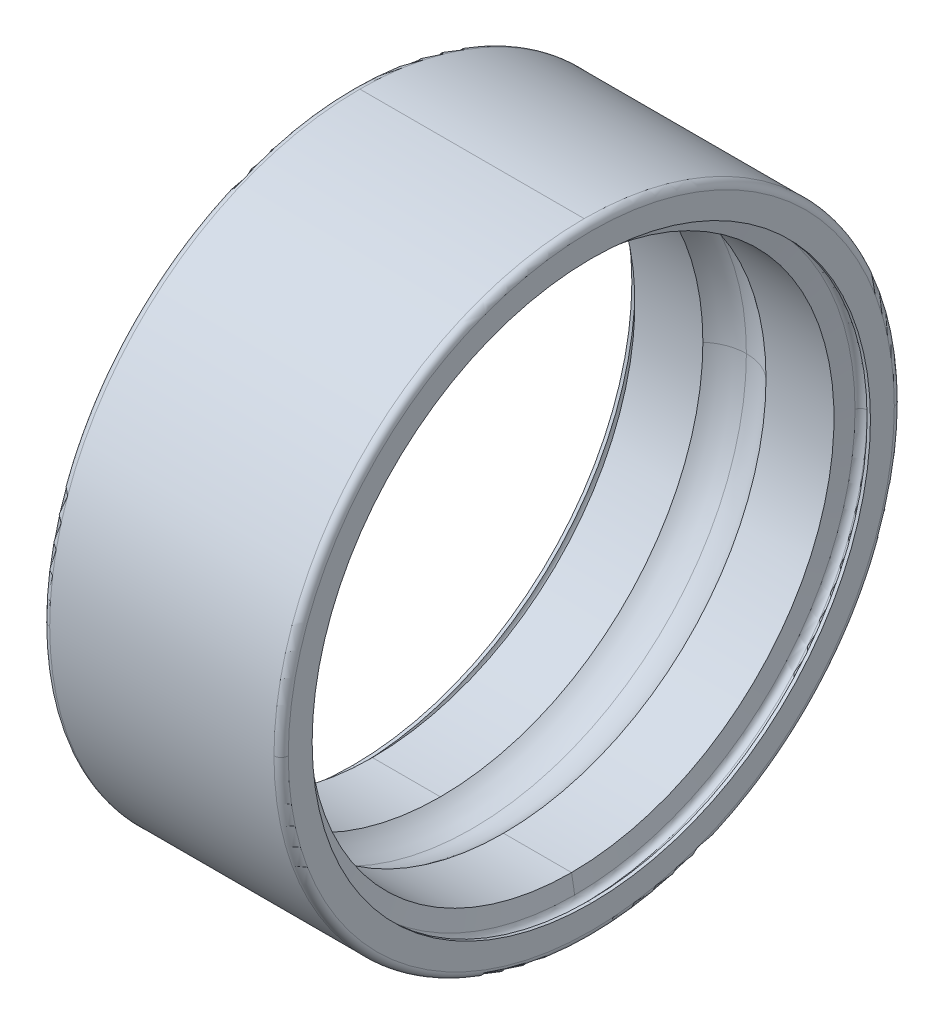
ISO-10303-21;
HEADER;
FILE_DESCRIPTION(('STEP AP214'),'2;1');
FILE_NAME('part.step','',(''),(''),'','','');
FILE_SCHEMA(('AUTOMOTIVE_DESIGN { 1 0 10303 214 1 1 1 1 }'));
ENDSEC;
DATA;
#1=APPLICATION_CONTEXT('core data for automotive mechanical design processes');
#2=APPLICATION_PROTOCOL_DEFINITION('international standard','automotive_design',2000,#1);
#3=PRODUCT_CONTEXT('',#1,'mechanical');
#4=PRODUCT('Part','Part','',(#3));
#5=PRODUCT_RELATED_PRODUCT_CATEGORY('part','',(#4));
#6=PRODUCT_DEFINITION_FORMATION('','',#4);
#7=PRODUCT_DEFINITION_CONTEXT('part definition',#1,'design');
#8=PRODUCT_DEFINITION('design','',#6,#7);
#9=PRODUCT_DEFINITION_SHAPE('','',#8);
#10=(LENGTH_UNIT() NAMED_UNIT(*) SI_UNIT(.MILLI.,.METRE.));
#11=(NAMED_UNIT(*) PLANE_ANGLE_UNIT() SI_UNIT($,.RADIAN.));
#12=(NAMED_UNIT(*) SI_UNIT($,.STERADIAN.) SOLID_ANGLE_UNIT());
#13=UNCERTAINTY_MEASURE_WITH_UNIT(LENGTH_MEASURE(1.E-05),#10,'distance_accuracy_value','');
#14=(GEOMETRIC_REPRESENTATION_CONTEXT(3) GLOBAL_UNCERTAINTY_ASSIGNED_CONTEXT((#13)) GLOBAL_UNIT_ASSIGNED_CONTEXT((#10,
#11,#12)) REPRESENTATION_CONTEXT('',''));
#15=CARTESIAN_POINT('',(0.,0.,0.));
#16=DIRECTION('',(0.,0.,1.));
#17=DIRECTION('',(1.,0.,0.));
#18=AXIS2_PLACEMENT_3D('',#15,#16,#17);
#19=CARTESIAN_POINT('',(4.79,0.,0.));
#20=DIRECTION('',(1.,0.,0.));
#21=DIRECTION('',(0.,0.,-1.));
#22=AXIS2_PLACEMENT_3D('',#19,#20,#21);
#23=TOROIDAL_SURFACE('',#22,5.85,0.14);
#24=CARTESIAN_POINT('',(4.79,0.,0.));
#25=DIRECTION('',(1.,0.,0.));
#26=DIRECTION('',(0.,0.,1.));
#27=AXIS2_PLACEMENT_3D('',#24,#25,#26);
#28=CIRCLE('',#27,5.99);
#29=CARTESIAN_POINT('',(4.79,0.,-5.99));
#30=VERTEX_POINT('',#29);
#31=CARTESIAN_POINT('',(4.79,0.,5.99));
#32=VERTEX_POINT('',#31);
#33=EDGE_CURVE('E420',#30,#32,#28,.T.);
#34=ORIENTED_EDGE('',*,*,#33,.T.);
#35=CARTESIAN_POINT('',(4.79,0.,5.85));
#36=DIRECTION('',(0.,-1.,0.));
#37=DIRECTION('',(0.,0.,1.));
#38=AXIS2_PLACEMENT_3D('',#35,#36,#37);
#39=CIRCLE('',#38,0.14);
#40=CARTESIAN_POINT('',(4.65212691457829,0.,5.87431074487337));
#41=VERTEX_POINT('',#40);
#42=EDGE_CURVE('E266',#32,#41,#39,.T.);
#43=ORIENTED_EDGE('',*,*,#42,.T.);
#44=CARTESIAN_POINT('',(4.65212691457829,0.,0.));
#45=DIRECTION('',(1.,0.,0.));
#46=DIRECTION('',(0.,1.,0.));
#47=AXIS2_PLACEMENT_3D('',#44,#45,#46);
#48=CIRCLE('',#47,5.87431074487337);
#49=CARTESIAN_POINT('',(4.65212691457829,5.87431074487337,0.));
#50=VERTEX_POINT('',#49);
#51=EDGE_CURVE('E31',#50,#41,#48,.T.);
#52=ORIENTED_EDGE('',*,*,#51,.F.);
#53=CARTESIAN_POINT('',(4.65212691457829,0.,0.));
#54=DIRECTION('',(1.,0.,0.));
#55=DIRECTION('',(0.,1.,0.));
#56=AXIS2_PLACEMENT_3D('',#53,#54,#55);
#57=CIRCLE('',#56,5.87431074487337);
#58=CARTESIAN_POINT('',(4.65212691457829,0.,-5.87431074487337));
#59=VERTEX_POINT('',#58);
#60=EDGE_CURVE('E204',#59,#50,#57,.T.);
#61=ORIENTED_EDGE('',*,*,#60,.F.);
#62=CARTESIAN_POINT('',(4.79,0.,-5.85));
#63=DIRECTION('',(0.,-1.,0.));
#64=DIRECTION('',(0.,0.,-1.));
#65=AXIS2_PLACEMENT_3D('',#62,#63,#64);
#66=CIRCLE('',#65,0.14);
#67=EDGE_CURVE('E252',#59,#30,#66,.T.);
#68=ORIENTED_EDGE('',*,*,#67,.T.);
#69=EDGE_LOOP('',(#34,#43,#52,#61,#68));
#70=FACE_BOUND('',#69,.T.);
#71=ADVANCED_FACE('F16',(#70),#23,.F.);
#72=CARTESIAN_POINT('',(4.965,0.,0.));
#73=DIRECTION('',(1.,0.,0.));
#74=DIRECTION('',(0.,1.,0.));
#75=AXIS2_PLACEMENT_3D('',#72,#73,#74);
#76=CYLINDRICAL_SURFACE('',#75,5.85);
#77=DIRECTION('',(1.,0.,0.));
#78=VECTOR('',#77,1.);
#79=CARTESIAN_POINT('',(4.965,5.85,0.));
#80=LINE('',#79,#78);
#81=CARTESIAN_POINT('',(4.93,5.85,0.));
#82=VERTEX_POINT('',#81);
#83=CARTESIAN_POINT('',(5.,5.85,0.));
#84=VERTEX_POINT('',#83);
#85=EDGE_CURVE('E268',#82,#84,#80,.T.);
#86=ORIENTED_EDGE('',*,*,#85,.T.);
#87=CARTESIAN_POINT('',(5.,0.,0.));
#88=DIRECTION('',(1.,0.,0.));
#89=DIRECTION('',(0.,1.,0.));
#90=AXIS2_PLACEMENT_3D('',#87,#88,#89);
#91=CIRCLE('',#90,5.85);
#92=CARTESIAN_POINT('',(5.,-5.85,0.));
#93=VERTEX_POINT('',#92);
#94=EDGE_CURVE('E11',#84,#93,#91,.T.);
#95=ORIENTED_EDGE('',*,*,#94,.T.);
#96=DIRECTION('',(-1.,0.,0.));
#97=VECTOR('',#96,1.);
#98=CARTESIAN_POINT('',(4.965,-5.85,0.));
#99=LINE('',#98,#97);
#100=CARTESIAN_POINT('',(4.93,-5.85,0.));
#101=VERTEX_POINT('',#100);
#102=EDGE_CURVE('E271',#93,#101,#99,.T.);
#103=ORIENTED_EDGE('',*,*,#102,.T.);
#104=CARTESIAN_POINT('',(4.93,0.,0.));
#105=DIRECTION('',(1.,0.,0.));
#106=DIRECTION('',(0.,1.,0.));
#107=AXIS2_PLACEMENT_3D('',#104,#105,#106);
#108=CIRCLE('',#107,5.85);
#109=CARTESIAN_POINT('',(4.93,0.,5.85));
#110=VERTEX_POINT('',#109);
#111=EDGE_CURVE('E241',#110,#101,#108,.T.);
#112=ORIENTED_EDGE('',*,*,#111,.F.);
#113=CARTESIAN_POINT('',(4.93,0.,0.));
#114=DIRECTION('',(1.,0.,0.));
#115=DIRECTION('',(0.,1.,0.));
#116=AXIS2_PLACEMENT_3D('',#113,#114,#115);
#117=CIRCLE('',#116,5.85);
#118=EDGE_CURVE('E386',#82,#110,#117,.T.);
#119=ORIENTED_EDGE('',*,*,#118,.F.);
#120=EDGE_LOOP('',(#86,#95,#103,#112,#119));
#121=FACE_BOUND('',#120,.T.);
#122=ADVANCED_FACE('F410',(#121),#76,.F.);
#123=CARTESIAN_POINT('',(5.,6.1,0.));
#124=DIRECTION('',(1.,0.,0.));
#125=DIRECTION('',(0.,1.,0.));
#126=AXIS2_PLACEMENT_3D('',#123,#124,#125);
#127=PLANE('',#126);
#128=ORIENTED_EDGE('',*,*,#94,.F.);
#129=CARTESIAN_POINT('',(5.,0.,0.));
#130=DIRECTION('',(1.,0.,0.));
#131=DIRECTION('',(0.,1.,0.));
#132=AXIS2_PLACEMENT_3D('',#129,#130,#131);
#133=CIRCLE('',#132,5.85);
#134=EDGE_CURVE('E273',#93,#84,#133,.T.);
#135=ORIENTED_EDGE('',*,*,#134,.F.);
#136=EDGE_LOOP('',(#128,#135));
#137=FACE_BOUND('',#136,.T.);
#138=CARTESIAN_POINT('',(5.,0.,0.));
#139=DIRECTION('',(1.,0.,0.));
#140=DIRECTION('',(0.,1.,0.));
#141=AXIS2_PLACEMENT_3D('',#138,#139,#140);
#142=CIRCLE('',#141,6.35);
#143=CARTESIAN_POINT('',(5.,0.,6.35));
#144=VERTEX_POINT('',#143);
#145=CARTESIAN_POINT('',(5.,0.,-6.35));
#146=VERTEX_POINT('',#145);
#147=EDGE_CURVE('E19',#144,#146,#142,.T.);
#148=ORIENTED_EDGE('',*,*,#147,.T.);
#149=CARTESIAN_POINT('',(5.,0.,0.));
#150=DIRECTION('',(1.,0.,0.));
#151=DIRECTION('',(0.,1.,0.));
#152=AXIS2_PLACEMENT_3D('',#149,#150,#151);
#153=CIRCLE('',#152,6.35);
#154=EDGE_CURVE('E279',#146,#144,#153,.T.);
#155=ORIENTED_EDGE('',*,*,#154,.T.);
#156=EDGE_LOOP('',(#148,#155));
#157=FACE_BOUND('',#156,.T.);
#158=ADVANCED_FACE('F414',(#137,#157),#127,.T.);
#159=CARTESIAN_POINT('',(4.85,0.,0.));
#160=DIRECTION('',(1.,0.,0.));
#161=DIRECTION('',(0.,0.,-1.));
#162=AXIS2_PLACEMENT_3D('',#159,#160,#161);
#163=TOROIDAL_SURFACE('',#162,6.35,0.15);
#164=CARTESIAN_POINT('',(4.85,0.,-6.35));
#165=DIRECTION('',(0.,-1.,0.));
#166=DIRECTION('',(0.,0.,-1.));
#167=AXIS2_PLACEMENT_3D('',#164,#165,#166);
#168=CIRCLE('',#167,0.15);
#169=CARTESIAN_POINT('',(4.85,0.,-6.5));
#170=VERTEX_POINT('',#169);
#171=EDGE_CURVE('E276',#170,#146,#168,.T.);
#172=ORIENTED_EDGE('',*,*,#171,.T.);
#173=ORIENTED_EDGE('',*,*,#147,.F.);
#174=CARTESIAN_POINT('',(4.85,0.,6.35));
#175=DIRECTION('',(0.,-1.,0.));
#176=DIRECTION('',(0.,0.,1.));
#177=AXIS2_PLACEMENT_3D('',#174,#175,#176);
#178=CIRCLE('',#177,0.15);
#179=CARTESIAN_POINT('',(4.85,0.,6.5));
#180=VERTEX_POINT('',#179);
#181=EDGE_CURVE('E283',#144,#180,#178,.T.);
#182=ORIENTED_EDGE('',*,*,#181,.T.);
#183=CARTESIAN_POINT('',(4.85,0.,0.));
#184=DIRECTION('',(1.,0.,0.));
#185=DIRECTION('',(0.,1.,0.));
#186=AXIS2_PLACEMENT_3D('',#183,#184,#185);
#187=CIRCLE('',#186,6.5);
#188=CARTESIAN_POINT('',(4.85,-6.5,0.));
#189=VERTEX_POINT('',#188);
#190=EDGE_CURVE('E293',#180,#189,#187,.T.);
#191=ORIENTED_EDGE('',*,*,#190,.T.);
#192=CARTESIAN_POINT('',(4.85,0.,0.));
#193=DIRECTION('',(1.,0.,0.));
#194=DIRECTION('',(0.,1.,0.));
#195=AXIS2_PLACEMENT_3D('',#192,#193,#194);
#196=CIRCLE('',#195,6.5);
#197=EDGE_CURVE('E214',#189,#170,#196,.T.);
#198=ORIENTED_EDGE('',*,*,#197,.T.);
#199=EDGE_LOOP('',(#172,#173,#182,#191,#198));
#200=FACE_BOUND('',#199,.T.);
#201=ADVANCED_FACE('F450',(#200),#163,.T.);
#202=CARTESIAN_POINT('',(2.5,0.,0.));
#203=DIRECTION('',(1.,0.,0.));
#204=DIRECTION('',(0.,1.,0.));
#205=AXIS2_PLACEMENT_3D('',#202,#203,#204);
#206=CYLINDRICAL_SURFACE('',#205,6.5);
#207=DIRECTION('',(1.,0.,0.));
#208=VECTOR('',#207,1.);
#209=CARTESIAN_POINT('',(2.5,6.5,0.));
#210=LINE('',#209,#208);
#211=CARTESIAN_POINT('',(0.15,6.5,0.));
#212=VERTEX_POINT('',#211);
#213=CARTESIAN_POINT('',(4.85,6.5,0.));
#214=VERTEX_POINT('',#213);
#215=EDGE_CURVE('E282',#212,#214,#210,.T.);
#216=ORIENTED_EDGE('',*,*,#215,.T.);
#217=CARTESIAN_POINT('',(4.85,0.,0.));
#218=DIRECTION('',(1.,0.,0.));
#219=DIRECTION('',(0.,1.,0.));
#220=AXIS2_PLACEMENT_3D('',#217,#218,#219);
#221=CIRCLE('',#220,6.5);
#222=EDGE_CURVE('E278',#170,#214,#221,.T.);
#223=ORIENTED_EDGE('',*,*,#222,.F.);
#224=ORIENTED_EDGE('',*,*,#197,.F.);
#225=DIRECTION('',(-1.,0.,0.));
#226=VECTOR('',#225,1.);
#227=CARTESIAN_POINT('',(2.5,-6.5,0.));
#228=LINE('',#227,#226);
#229=CARTESIAN_POINT('',(0.15,-6.5,0.));
#230=VERTEX_POINT('',#229);
#231=EDGE_CURVE('E291',#189,#230,#228,.T.);
#232=ORIENTED_EDGE('',*,*,#231,.T.);
#233=CARTESIAN_POINT('',(0.15,0.,0.));
#234=DIRECTION('',(1.,0.,0.));
#235=DIRECTION('',(0.,1.,0.));
#236=AXIS2_PLACEMENT_3D('',#233,#234,#235);
#237=CIRCLE('',#236,6.5);
#238=CARTESIAN_POINT('',(0.15,0.,-6.5));
#239=VERTEX_POINT('',#238);
#240=EDGE_CURVE('E213',#230,#239,#237,.T.);
#241=ORIENTED_EDGE('',*,*,#240,.T.);
#242=CARTESIAN_POINT('',(0.15,0.,0.));
#243=DIRECTION('',(1.,0.,0.));
#244=DIRECTION('',(0.,1.,0.));
#245=AXIS2_PLACEMENT_3D('',#242,#243,#244);
#246=CIRCLE('',#245,6.5);
#247=EDGE_CURVE('E305',#239,#212,#246,.T.);
#248=ORIENTED_EDGE('',*,*,#247,.T.);
#249=EDGE_LOOP('',(#216,#223,#224,#232,#241,#248));
#250=FACE_BOUND('',#249,.T.);
#251=ADVANCED_FACE('F461',(#250),#206,.T.);
#252=CARTESIAN_POINT('',(0.15,0.,0.));
#253=DIRECTION('',(1.,0.,0.));
#254=DIRECTION('',(0.,0.,-1.));
#255=AXIS2_PLACEMENT_3D('',#252,#253,#254);
#256=TOROIDAL_SURFACE('',#255,6.35,0.15);
#257=CARTESIAN_POINT('',(0.15,0.,-6.35));
#258=DIRECTION('',(0.,-1.,0.));
#259=DIRECTION('',(0.,0.,-1.));
#260=AXIS2_PLACEMENT_3D('',#257,#258,#259);
#261=CIRCLE('',#260,0.15);
#262=CARTESIAN_POINT('',(0.,0.,-6.35));
#263=VERTEX_POINT('',#262);
#264=EDGE_CURVE('E295',#263,#239,#261,.T.);
#265=ORIENTED_EDGE('',*,*,#264,.T.);
#266=ORIENTED_EDGE('',*,*,#240,.F.);
#267=CARTESIAN_POINT('',(0.15,0.,0.));
#268=DIRECTION('',(1.,0.,0.));
#269=DIRECTION('',(0.,1.,0.));
#270=AXIS2_PLACEMENT_3D('',#267,#268,#269);
#271=CIRCLE('',#270,6.5);
#272=CARTESIAN_POINT('',(0.15,0.,6.5));
#273=VERTEX_POINT('',#272);
#274=EDGE_CURVE('E288',#273,#230,#271,.T.);
#275=ORIENTED_EDGE('',*,*,#274,.F.);
#276=CARTESIAN_POINT('',(0.15,0.,6.35));
#277=DIRECTION('',(0.,-1.,0.));
#278=DIRECTION('',(0.,0.,1.));
#279=AXIS2_PLACEMENT_3D('',#276,#277,#278);
#280=CIRCLE('',#279,0.15);
#281=CARTESIAN_POINT('',(0.,0.,6.35));
#282=VERTEX_POINT('',#281);
#283=EDGE_CURVE('E302',#273,#282,#280,.T.);
#284=ORIENTED_EDGE('',*,*,#283,.T.);
#285=CARTESIAN_POINT('',(0.,0.,0.));
#286=DIRECTION('',(1.,0.,0.));
#287=DIRECTION('',(0.,1.,0.));
#288=AXIS2_PLACEMENT_3D('',#285,#286,#287);
#289=CIRCLE('',#288,6.35);
#290=EDGE_CURVE('E212',#282,#263,#289,.T.);
#291=ORIENTED_EDGE('',*,*,#290,.T.);
#292=EDGE_LOOP('',(#265,#266,#275,#284,#291));
#293=FACE_BOUND('',#292,.T.);
#294=ADVANCED_FACE('F544',(#293),#256,.T.);
#295=CARTESIAN_POINT('',(0.,6.1,0.));
#296=DIRECTION('',(-1.,0.,0.));
#297=DIRECTION('',(0.,0.,1.));
#298=AXIS2_PLACEMENT_3D('',#295,#296,#297);
#299=PLANE('',#298);
#300=CARTESIAN_POINT('',(0.,0.,0.));
#301=DIRECTION('',(1.,0.,0.));
#302=DIRECTION('',(0.,1.,0.));
#303=AXIS2_PLACEMENT_3D('',#300,#301,#302);
#304=CIRCLE('',#303,5.85);
#305=CARTESIAN_POINT('',(0.,5.85,0.));
#306=VERTEX_POINT('',#305);
#307=CARTESIAN_POINT('',(0.,-5.85,0.));
#308=VERTEX_POINT('',#307);
#309=EDGE_CURVE('E209',#306,#308,#304,.T.);
#310=ORIENTED_EDGE('',*,*,#309,.T.);
#311=CARTESIAN_POINT('',(0.,0.,0.));
#312=DIRECTION('',(1.,0.,0.));
#313=DIRECTION('',(0.,1.,0.));
#314=AXIS2_PLACEMENT_3D('',#311,#312,#313);
#315=CIRCLE('',#314,5.85);
#316=EDGE_CURVE('E310',#308,#306,#315,.T.);
#317=ORIENTED_EDGE('',*,*,#316,.T.);
#318=EDGE_LOOP('',(#310,#317));
#319=FACE_BOUND('',#318,.T.);
#320=CARTESIAN_POINT('',(0.,0.,0.));
#321=DIRECTION('',(1.,0.,0.));
#322=DIRECTION('',(0.,1.,0.));
#323=AXIS2_PLACEMENT_3D('',#320,#321,#322);
#324=CIRCLE('',#323,6.35);
#325=EDGE_CURVE('E298',#263,#282,#324,.T.);
#326=ORIENTED_EDGE('',*,*,#325,.F.);
#327=ORIENTED_EDGE('',*,*,#290,.F.);
#328=EDGE_LOOP('',(#326,#327));
#329=FACE_BOUND('',#328,.T.);
#330=ADVANCED_FACE('F540',(#319,#329),#299,.T.);
#331=CARTESIAN_POINT('',(0.035,0.,0.));
#332=DIRECTION('',(1.,0.,0.));
#333=DIRECTION('',(0.,1.,0.));
#334=AXIS2_PLACEMENT_3D('',#331,#332,#333);
#335=CYLINDRICAL_SURFACE('',#334,5.85);
#336=DIRECTION('',(1.,0.,0.));
#337=VECTOR('',#336,1.);
#338=CARTESIAN_POINT('',(0.035,5.85,0.));
#339=LINE('',#338,#337);
#340=CARTESIAN_POINT('',(0.07,5.85,0.));
#341=VERTEX_POINT('',#340);
#342=EDGE_CURVE('E307',#306,#341,#339,.T.);
#343=ORIENTED_EDGE('',*,*,#342,.T.);
#344=CARTESIAN_POINT('',(0.07,0.,0.));
#345=DIRECTION('',(1.,0.,0.));
#346=DIRECTION('',(0.,1.,0.));
#347=AXIS2_PLACEMENT_3D('',#344,#345,#346);
#348=CIRCLE('',#347,5.85);
#349=CARTESIAN_POINT('',(0.07,0.,5.85));
#350=VERTEX_POINT('',#349);
#351=EDGE_CURVE('E208',#341,#350,#348,.T.);
#352=ORIENTED_EDGE('',*,*,#351,.T.);
#353=CARTESIAN_POINT('',(0.07,0.,0.));
#354=DIRECTION('',(1.,0.,0.));
#355=DIRECTION('',(0.,1.,0.));
#356=AXIS2_PLACEMENT_3D('',#353,#354,#355);
#357=CIRCLE('',#356,5.85);
#358=CARTESIAN_POINT('',(0.07,-5.85,0.));
#359=VERTEX_POINT('',#358);
#360=EDGE_CURVE('E246',#350,#359,#357,.T.);
#361=ORIENTED_EDGE('',*,*,#360,.T.);
#362=DIRECTION('',(-1.,0.,0.));
#363=VECTOR('',#362,1.);
#364=CARTESIAN_POINT('',(0.035,-5.85,0.));
#365=LINE('',#364,#363);
#366=EDGE_CURVE('E313',#359,#308,#365,.T.);
#367=ORIENTED_EDGE('',*,*,#366,.T.);
#368=ORIENTED_EDGE('',*,*,#309,.F.);
#369=EDGE_LOOP('',(#343,#352,#361,#367,#368));
#370=FACE_BOUND('',#369,.T.);
#371=ADVANCED_FACE('F537',(#370),#335,.F.);
#372=CARTESIAN_POINT('',(0.21,0.,0.));
#373=DIRECTION('',(1.,0.,0.));
#374=DIRECTION('',(0.,0.,-1.));
#375=AXIS2_PLACEMENT_3D('',#372,#373,#374);
#376=TOROIDAL_SURFACE('',#375,5.85,0.14);
#377=CARTESIAN_POINT('',(0.21,0.,0.));
#378=DIRECTION('',(1.,0.,0.));
#379=DIRECTION('',(0.,0.,1.));
#380=AXIS2_PLACEMENT_3D('',#377,#378,#379);
#381=CIRCLE('',#380,5.99);
#382=CARTESIAN_POINT('',(0.21,0.,-5.99));
#383=VERTEX_POINT('',#382);
#384=CARTESIAN_POINT('',(0.21,0.,5.99));
#385=VERTEX_POINT('',#384);
#386=EDGE_CURVE('E377',#383,#385,#381,.T.);
#387=ORIENTED_EDGE('',*,*,#386,.T.);
#388=CARTESIAN_POINT('',(0.21,0.,5.85));
#389=DIRECTION('',(0.,-1.,0.));
#390=DIRECTION('',(0.,0.,1.));
#391=AXIS2_PLACEMENT_3D('',#388,#389,#390);
#392=CIRCLE('',#391,0.14);
#393=EDGE_CURVE('E242',#385,#350,#392,.T.);
#394=ORIENTED_EDGE('',*,*,#393,.T.);
#395=ORIENTED_EDGE('',*,*,#351,.F.);
#396=CARTESIAN_POINT('',(0.07,0.,0.));
#397=DIRECTION('',(1.,0.,0.));
#398=DIRECTION('',(0.,1.,0.));
#399=AXIS2_PLACEMENT_3D('',#396,#397,#398);
#400=CIRCLE('',#399,5.85);
#401=CARTESIAN_POINT('',(0.07,0.,-5.85));
#402=VERTEX_POINT('',#401);
#403=EDGE_CURVE('E228',#402,#341,#400,.T.);
#404=ORIENTED_EDGE('',*,*,#403,.F.);
#405=CARTESIAN_POINT('',(0.21,0.,-5.85));
#406=DIRECTION('',(0.,-1.,0.));
#407=DIRECTION('',(0.,0.,-1.));
#408=AXIS2_PLACEMENT_3D('',#405,#406,#407);
#409=CIRCLE('',#408,0.14);
#410=EDGE_CURVE('E231',#402,#383,#409,.T.);
#411=ORIENTED_EDGE('',*,*,#410,.T.);
#412=EDGE_LOOP('',(#387,#394,#395,#404,#411));
#413=FACE_BOUND('',#412,.T.);
#414=ADVANCED_FACE('F534',(#413),#376,.F.);
#415=CARTESIAN_POINT('',(0.380873627166838,0.,0.));
#416=DIRECTION('',(-1.,0.,0.));
#417=DIRECTION('',(0.,1.,0.));
#418=AXIS2_PLACEMENT_3D('',#415,#416,#417);
#419=CONICAL_SURFACE('',#418,5.68715537243669,1.39626340159546);
#420=DIRECTION('',(0.173648177666931,-0.984807753012208,0.));
#421=VECTOR('',#420,1.);
#422=CARTESIAN_POINT('',(0.380873627166838,5.68715537243669,0.));
#423=LINE('',#422,#421);
#424=CARTESIAN_POINT('',(0.347873085421709,5.87431074487337,0.));
#425=VERTEX_POINT('',#424);
#426=CARTESIAN_POINT('',(0.413874168911967,5.5,0.));
#427=VERTEX_POINT('',#426);
#428=EDGE_CURVE('E245',#425,#427,#423,.T.);
#429=ORIENTED_EDGE('',*,*,#428,.T.);
#430=CARTESIAN_POINT('',(0.413874168911967,0.,0.));
#431=DIRECTION('',(1.,0.,0.));
#432=DIRECTION('',(0.,1.,0.));
#433=AXIS2_PLACEMENT_3D('',#430,#431,#432);
#434=CIRCLE('',#433,5.5);
#435=CARTESIAN_POINT('',(0.413874168911967,-5.5,0.));
#436=VERTEX_POINT('',#435);
#437=EDGE_CURVE('E175',#427,#436,#434,.T.);
#438=ORIENTED_EDGE('',*,*,#437,.T.);
#439=DIRECTION('',(-0.173648177666931,-0.984807753012208,0.));
#440=VECTOR('',#439,1.);
#441=CARTESIAN_POINT('',(0.380873627166838,-5.68715537243669,0.));
#442=LINE('',#441,#440);
#443=CARTESIAN_POINT('',(0.347873085421709,-5.87431074487337,0.));
#444=VERTEX_POINT('',#443);
#445=EDGE_CURVE('E253',#436,#444,#442,.T.);
#446=ORIENTED_EDGE('',*,*,#445,.T.);
#447=CARTESIAN_POINT('',(0.347873085421709,0.,0.));
#448=DIRECTION('',(1.,0.,0.));
#449=DIRECTION('',(0.,1.,0.));
#450=AXIS2_PLACEMENT_3D('',#447,#448,#449);
#451=CIRCLE('',#450,5.87431074487337);
#452=CARTESIAN_POINT('',(0.347873085421709,0.,5.87431074487337));
#453=VERTEX_POINT('',#452);
#454=EDGE_CURVE('E233',#453,#444,#451,.T.);
#455=ORIENTED_EDGE('',*,*,#454,.F.);
#456=CARTESIAN_POINT('',(0.347873085421709,0.,0.));
#457=DIRECTION('',(1.,0.,0.));
#458=DIRECTION('',(0.,1.,0.));
#459=AXIS2_PLACEMENT_3D('',#456,#457,#458);
#460=CIRCLE('',#459,5.87431074487337);
#461=EDGE_CURVE('E349',#425,#453,#460,.T.);
#462=ORIENTED_EDGE('',*,*,#461,.F.);
#463=EDGE_LOOP('',(#429,#438,#446,#455,#462));
#464=FACE_BOUND('',#463,.T.);
#465=ADVANCED_FACE('F393',(#464),#419,.F.);
#466=CARTESIAN_POINT('',(1.12621817057291,0.,0.));
#467=DIRECTION('',(1.,0.,0.));
#468=DIRECTION('',(0.,1.,0.));
#469=AXIS2_PLACEMENT_3D('',#466,#467,#468);
#470=CYLINDRICAL_SURFACE('',#469,5.5);
#471=DIRECTION('',(1.,0.,0.));
#472=VECTOR('',#471,1.);
#473=CARTESIAN_POINT('',(1.12621817057291,5.5,0.));
#474=LINE('',#473,#472);
#475=CARTESIAN_POINT('',(1.83856217223385,5.5,0.));
#476=VERTEX_POINT('',#475);
#477=EDGE_CURVE('E171',#427,#476,#474,.T.);
#478=ORIENTED_EDGE('',*,*,#477,.T.);
#479=CARTESIAN_POINT('',(1.83856217223385,0.,0.));
#480=DIRECTION('',(1.,0.,0.));
#481=DIRECTION('',(0.,1.,0.));
#482=AXIS2_PLACEMENT_3D('',#479,#480,#481);
#483=CIRCLE('',#482,5.5);
#484=CARTESIAN_POINT('',(1.83856217223385,0.,5.5));
#485=VERTEX_POINT('',#484);
#486=EDGE_CURVE('E163',#476,#485,#483,.T.);
#487=ORIENTED_EDGE('',*,*,#486,.T.);
#488=CARTESIAN_POINT('',(1.83856217223385,0.,0.));
#489=DIRECTION('',(1.,0.,0.));
#490=DIRECTION('',(0.,1.,0.));
#491=AXIS2_PLACEMENT_3D('',#488,#489,#490);
#492=CIRCLE('',#491,5.5);
#493=CARTESIAN_POINT('',(1.83856217223385,-5.5,0.));
#494=VERTEX_POINT('',#493);
#495=EDGE_CURVE('E168',#485,#494,#492,.T.);
#496=ORIENTED_EDGE('',*,*,#495,.T.);
#497=DIRECTION('',(-1.,0.,0.));
#498=VECTOR('',#497,1.);
#499=CARTESIAN_POINT('',(1.12621817057291,-5.5,0.));
#500=LINE('',#499,#498);
#501=EDGE_CURVE('E319',#494,#436,#500,.T.);
#502=ORIENTED_EDGE('',*,*,#501,.T.);
#503=ORIENTED_EDGE('',*,*,#437,.F.);
#504=EDGE_LOOP('',(#478,#487,#496,#502,#503));
#505=FACE_BOUND('',#504,.T.);
#506=ADVANCED_FACE('F165',(#505),#470,.F.);
#507=CARTESIAN_POINT('',(2.5,0.,0.));
#508=DIRECTION('',(1.,0.,0.));
#509=DIRECTION('',(0.,0.,-1.));
#510=AXIS2_PLACEMENT_3D('',#507,#508,#509);
#511=TOROIDAL_SURFACE('',#510,4.75,1.);
#512=CARTESIAN_POINT('',(2.5,0.,0.));
#513=DIRECTION('',(1.,0.,0.));
#514=DIRECTION('',(0.,0.,1.));
#515=AXIS2_PLACEMENT_3D('',#512,#513,#514);
#516=CIRCLE('',#515,5.75);
#517=CARTESIAN_POINT('',(2.5,0.,-5.75));
#518=VERTEX_POINT('',#517);
#519=CARTESIAN_POINT('',(2.5,0.,5.75));
#520=VERTEX_POINT('',#519);
#521=EDGE_CURVE('E181',#518,#520,#516,.T.);
#522=ORIENTED_EDGE('',*,*,#521,.T.);
#523=CARTESIAN_POINT('',(2.5,0.,4.75));
#524=DIRECTION('',(0.,-1.,0.));
#525=DIRECTION('',(0.,0.,1.));
#526=AXIS2_PLACEMENT_3D('',#523,#524,#525);
#527=CIRCLE('',#526,1.);
#528=EDGE_CURVE('E178',#520,#485,#527,.T.);
#529=ORIENTED_EDGE('',*,*,#528,.T.);
#530=ORIENTED_EDGE('',*,*,#486,.F.);
#531=CARTESIAN_POINT('',(1.83856217223385,0.,0.));
#532=DIRECTION('',(1.,0.,0.));
#533=DIRECTION('',(0.,1.,0.));
#534=AXIS2_PLACEMENT_3D('',#531,#532,#533);
#535=CIRCLE('',#534,5.5);
#536=CARTESIAN_POINT('',(1.83856217223385,0.,-5.5));
#537=VERTEX_POINT('',#536);
#538=EDGE_CURVE('E193',#537,#476,#535,.T.);
#539=ORIENTED_EDGE('',*,*,#538,.F.);
#540=CARTESIAN_POINT('',(2.5,0.,-4.75));
#541=DIRECTION('',(0.,-1.,0.));
#542=DIRECTION('',(0.,0.,-1.));
#543=AXIS2_PLACEMENT_3D('',#540,#541,#542);
#544=CIRCLE('',#543,1.);
#545=EDGE_CURVE('E191',#537,#518,#544,.T.);
#546=ORIENTED_EDGE('',*,*,#545,.T.);
#547=EDGE_LOOP('',(#522,#529,#530,#539,#546));
#548=FACE_BOUND('',#547,.T.);
#549=ADVANCED_FACE('F179',(#548),#511,.F.);
#550=CARTESIAN_POINT('',(3.87378182942709,0.,0.));
#551=DIRECTION('',(1.,0.,0.));
#552=DIRECTION('',(0.,1.,0.));
#553=AXIS2_PLACEMENT_3D('',#550,#551,#552);
#554=CYLINDRICAL_SURFACE('',#553,5.5);
#555=DIRECTION('',(1.,0.,0.));
#556=VECTOR('',#555,1.);
#557=CARTESIAN_POINT('',(3.87378182942709,5.5,0.));
#558=LINE('',#557,#556);
#559=CARTESIAN_POINT('',(3.16143782776615,5.5,0.));
#560=VERTEX_POINT('',#559);
#561=CARTESIAN_POINT('',(4.58612583108803,5.5,0.));
#562=VERTEX_POINT('',#561);
#563=EDGE_CURVE('E185',#560,#562,#558,.T.);
#564=ORIENTED_EDGE('',*,*,#563,.T.);
#565=CARTESIAN_POINT('',(4.58612583108803,0.,0.));
#566=DIRECTION('',(1.,0.,0.));
#567=DIRECTION('',(0.,1.,0.));
#568=AXIS2_PLACEMENT_3D('',#565,#566,#567);
#569=CIRCLE('',#568,5.5);
#570=CARTESIAN_POINT('',(4.58612583108803,-5.5,0.));
#571=VERTEX_POINT('',#570);
#572=EDGE_CURVE('E40',#562,#571,#569,.T.);
#573=ORIENTED_EDGE('',*,*,#572,.T.);
#574=DIRECTION('',(-1.,0.,0.));
#575=VECTOR('',#574,1.);
#576=CARTESIAN_POINT('',(3.87378182942709,-5.5,0.));
#577=LINE('',#576,#575);
#578=CARTESIAN_POINT('',(3.16143782776615,-5.5,0.));
#579=VERTEX_POINT('',#578);
#580=EDGE_CURVE('E198',#571,#579,#577,.T.);
#581=ORIENTED_EDGE('',*,*,#580,.T.);
#582=CARTESIAN_POINT('',(3.16143782776615,0.,0.));
#583=DIRECTION('',(1.,0.,0.));
#584=DIRECTION('',(0.,1.,0.));
#585=AXIS2_PLACEMENT_3D('',#582,#583,#584);
#586=CIRCLE('',#585,5.5);
#587=CARTESIAN_POINT('',(3.16143782776615,0.,5.5));
#588=VERTEX_POINT('',#587);
#589=EDGE_CURVE('E329',#588,#579,#586,.T.);
#590=ORIENTED_EDGE('',*,*,#589,.F.);
#591=CARTESIAN_POINT('',(3.16143782776615,0.,0.));
#592=DIRECTION('',(1.,0.,0.));
#593=DIRECTION('',(0.,1.,0.));
#594=AXIS2_PLACEMENT_3D('',#591,#592,#593);
#595=CIRCLE('',#594,5.5);
#596=EDGE_CURVE('E434',#560,#588,#595,.T.);
#597=ORIENTED_EDGE('',*,*,#596,.F.);
#598=EDGE_LOOP('',(#564,#573,#581,#590,#597));
#599=FACE_BOUND('',#598,.T.);
#600=ADVANCED_FACE('F524',(#599),#554,.F.);
#601=CARTESIAN_POINT('',(4.61912637283316,0.,0.));
#602=DIRECTION('',(1.,0.,0.));
#603=DIRECTION('',(0.,1.,0.));
#604=AXIS2_PLACEMENT_3D('',#601,#602,#603);
#605=CONICAL_SURFACE('',#604,5.68715537243668,1.39626340159546);
#606=DIRECTION('',(0.173648177666932,0.984807753012208,0.));
#607=VECTOR('',#606,1.);
#608=CARTESIAN_POINT('',(4.61912637283316,5.68715537243668,0.));
#609=LINE('',#608,#607);
#610=EDGE_CURVE('E199',#562,#50,#609,.T.);
#611=ORIENTED_EDGE('',*,*,#610,.T.);
#612=ORIENTED_EDGE('',*,*,#51,.T.);
#613=CARTESIAN_POINT('',(4.65212691457829,0.,0.));
#614=DIRECTION('',(1.,0.,0.));
#615=DIRECTION('',(0.,1.,0.));
#616=AXIS2_PLACEMENT_3D('',#613,#614,#615);
#617=CIRCLE('',#616,5.87431074487337);
#618=CARTESIAN_POINT('',(4.65212691457829,-5.87431074487337,0.));
#619=VERTEX_POINT('',#618);
#620=EDGE_CURVE('E263',#41,#619,#617,.T.);
#621=ORIENTED_EDGE('',*,*,#620,.T.);
#622=DIRECTION('',(-0.173648177666932,0.984807753012208,0.));
#623=VECTOR('',#622,1.);
#624=CARTESIAN_POINT('',(4.61912637283316,-5.68715537243668,0.));
#625=LINE('',#624,#623);
#626=EDGE_CURVE('E202',#619,#571,#625,.T.);
#627=ORIENTED_EDGE('',*,*,#626,.T.);
#628=ORIENTED_EDGE('',*,*,#572,.F.);
#629=EDGE_LOOP('',(#611,#612,#621,#627,#628));
#630=FACE_BOUND('',#629,.T.);
#631=ADVANCED_FACE('F520',(#630),#605,.F.);
#632=CARTESIAN_POINT('',(4.61912637283316,0.,0.));
#633=DIRECTION('',(1.,0.,0.));
#634=DIRECTION('',(0.,1.,0.));
#635=AXIS2_PLACEMENT_3D('',#632,#633,#634);
#636=CONICAL_SURFACE('',#635,5.68715537243668,1.39626340159546);
#637=ORIENTED_EDGE('',*,*,#610,.F.);
#638=CARTESIAN_POINT('',(4.58612583108803,0.,0.));
#639=DIRECTION('',(1.,0.,0.));
#640=DIRECTION('',(0.,1.,0.));
#641=AXIS2_PLACEMENT_3D('',#638,#639,#640);
#642=CIRCLE('',#641,5.5);
#643=EDGE_CURVE('E203',#571,#562,#642,.T.);
#644=ORIENTED_EDGE('',*,*,#643,.F.);
#645=ORIENTED_EDGE('',*,*,#626,.F.);
#646=CARTESIAN_POINT('',(4.65212691457829,0.,0.));
#647=DIRECTION('',(1.,0.,0.));
#648=DIRECTION('',(0.,1.,0.));
#649=AXIS2_PLACEMENT_3D('',#646,#647,#648);
#650=CIRCLE('',#649,5.87431074487337);
#651=EDGE_CURVE('E258',#619,#59,#650,.T.);
#652=ORIENTED_EDGE('',*,*,#651,.T.);
#653=ORIENTED_EDGE('',*,*,#60,.T.);
#654=EDGE_LOOP('',(#637,#644,#645,#652,#653));
#655=FACE_BOUND('',#654,.T.);
#656=ADVANCED_FACE('F516',(#655),#636,.F.);
#657=CARTESIAN_POINT('',(3.87378182942709,0.,0.));
#658=DIRECTION('',(1.,0.,0.));
#659=DIRECTION('',(0.,1.,0.));
#660=AXIS2_PLACEMENT_3D('',#657,#658,#659);
#661=CYLINDRICAL_SURFACE('',#660,5.5);
#662=ORIENTED_EDGE('',*,*,#563,.F.);
#663=CARTESIAN_POINT('',(3.16143782776615,0.,0.));
#664=DIRECTION('',(1.,0.,0.));
#665=DIRECTION('',(0.,1.,0.));
#666=AXIS2_PLACEMENT_3D('',#663,#664,#665);
#667=CIRCLE('',#666,5.5);
#668=CARTESIAN_POINT('',(3.16143782776615,0.,-5.5));
#669=VERTEX_POINT('',#668);
#670=EDGE_CURVE('E342',#669,#560,#667,.T.);
#671=ORIENTED_EDGE('',*,*,#670,.F.);
#672=CARTESIAN_POINT('',(3.16143782776615,0.,0.));
#673=DIRECTION('',(1.,0.,0.));
#674=DIRECTION('',(0.,1.,0.));
#675=AXIS2_PLACEMENT_3D('',#672,#673,#674);
#676=CIRCLE('',#675,5.5);
#677=EDGE_CURVE('E338',#579,#669,#676,.T.);
#678=ORIENTED_EDGE('',*,*,#677,.F.);
#679=ORIENTED_EDGE('',*,*,#580,.F.);
#680=ORIENTED_EDGE('',*,*,#643,.T.);
#681=EDGE_LOOP('',(#662,#671,#678,#679,#680));
#682=FACE_BOUND('',#681,.T.);
#683=ADVANCED_FACE('F509',(#682),#661,.F.);
#684=CARTESIAN_POINT('',(2.5,0.,0.));
#685=DIRECTION('',(1.,0.,0.));
#686=DIRECTION('',(0.,0.,-1.));
#687=AXIS2_PLACEMENT_3D('',#684,#685,#686);
#688=TOROIDAL_SURFACE('',#687,4.75,1.);
#689=CARTESIAN_POINT('',(2.5,0.,0.));
#690=DIRECTION('',(1.,0.,0.));
#691=DIRECTION('',(0.,0.,1.));
#692=AXIS2_PLACEMENT_3D('',#689,#690,#691);
#693=CIRCLE('',#692,5.75);
#694=EDGE_CURVE('E324',#520,#518,#693,.T.);
#695=ORIENTED_EDGE('',*,*,#694,.T.);
#696=ORIENTED_EDGE('',*,*,#545,.F.);
#697=CARTESIAN_POINT('',(1.83856217223385,0.,0.));
#698=DIRECTION('',(1.,0.,0.));
#699=DIRECTION('',(0.,1.,0.));
#700=AXIS2_PLACEMENT_3D('',#697,#698,#699);
#701=CIRCLE('',#700,5.5);
#702=EDGE_CURVE('E189',#494,#537,#701,.T.);
#703=ORIENTED_EDGE('',*,*,#702,.F.);
#704=ORIENTED_EDGE('',*,*,#495,.F.);
#705=ORIENTED_EDGE('',*,*,#528,.F.);
#706=EDGE_LOOP('',(#695,#696,#703,#704,#705));
#707=FACE_BOUND('',#706,.T.);
#708=ADVANCED_FACE('F187',(#707),#688,.F.);
#709=CARTESIAN_POINT('',(1.12621817057291,0.,0.));
#710=DIRECTION('',(1.,0.,0.));
#711=DIRECTION('',(0.,1.,0.));
#712=AXIS2_PLACEMENT_3D('',#709,#710,#711);
#713=CYLINDRICAL_SURFACE('',#712,5.5);
#714=ORIENTED_EDGE('',*,*,#477,.F.);
#715=CARTESIAN_POINT('',(0.413874168911967,0.,0.));
#716=DIRECTION('',(1.,0.,0.));
#717=DIRECTION('',(0.,1.,0.));
#718=AXIS2_PLACEMENT_3D('',#715,#716,#717);
#719=CIRCLE('',#718,5.5);
#720=EDGE_CURVE('E255',#436,#427,#719,.T.);
#721=ORIENTED_EDGE('',*,*,#720,.F.);
#722=ORIENTED_EDGE('',*,*,#501,.F.);
#723=ORIENTED_EDGE('',*,*,#702,.T.);
#724=ORIENTED_EDGE('',*,*,#538,.T.);
#725=EDGE_LOOP('',(#714,#721,#722,#723,#724));
#726=FACE_BOUND('',#725,.T.);
#727=ADVANCED_FACE('F322',(#726),#713,.F.);
#728=CARTESIAN_POINT('',(0.380873627166838,0.,0.));
#729=DIRECTION('',(-1.,0.,0.));
#730=DIRECTION('',(0.,1.,0.));
#731=AXIS2_PLACEMENT_3D('',#728,#729,#730);
#732=CONICAL_SURFACE('',#731,5.68715537243669,1.39626340159546);
#733=ORIENTED_EDGE('',*,*,#428,.F.);
#734=CARTESIAN_POINT('',(0.347873085421709,0.,0.));
#735=DIRECTION('',(1.,0.,0.));
#736=DIRECTION('',(0.,1.,0.));
#737=AXIS2_PLACEMENT_3D('',#734,#735,#736);
#738=CIRCLE('',#737,5.87431074487337);
#739=CARTESIAN_POINT('',(0.347873085421709,0.,-5.87431074487337));
#740=VERTEX_POINT('',#739);
#741=EDGE_CURVE('E376',#740,#425,#738,.T.);
#742=ORIENTED_EDGE('',*,*,#741,.F.);
#743=CARTESIAN_POINT('',(0.347873085421709,0.,0.));
#744=DIRECTION('',(1.,0.,0.));
#745=DIRECTION('',(0.,1.,0.));
#746=AXIS2_PLACEMENT_3D('',#743,#744,#745);
#747=CIRCLE('',#746,5.87431074487337);
#748=EDGE_CURVE('E236',#444,#740,#747,.T.);
#749=ORIENTED_EDGE('',*,*,#748,.F.);
#750=ORIENTED_EDGE('',*,*,#445,.F.);
#751=ORIENTED_EDGE('',*,*,#720,.T.);
#752=EDGE_LOOP('',(#733,#742,#749,#750,#751));
#753=FACE_BOUND('',#752,.T.);
#754=ADVANCED_FACE('F396',(#753),#732,.F.);
#755=CARTESIAN_POINT('',(0.21,0.,0.));
#756=DIRECTION('',(1.,0.,0.));
#757=DIRECTION('',(0.,0.,-1.));
#758=AXIS2_PLACEMENT_3D('',#755,#756,#757);
#759=TOROIDAL_SURFACE('',#758,5.85,0.14);
#760=CARTESIAN_POINT('',(0.21,0.,0.));
#761=DIRECTION('',(1.,0.,0.));
#762=DIRECTION('',(0.,0.,1.));
#763=AXIS2_PLACEMENT_3D('',#760,#761,#762);
#764=CIRCLE('',#763,5.99);
#765=EDGE_CURVE('E226',#385,#383,#764,.T.);
#766=ORIENTED_EDGE('',*,*,#765,.T.);
#767=ORIENTED_EDGE('',*,*,#410,.F.);
#768=CARTESIAN_POINT('',(0.07,0.,0.));
#769=DIRECTION('',(1.,0.,0.));
#770=DIRECTION('',(0.,1.,0.));
#771=AXIS2_PLACEMENT_3D('',#768,#769,#770);
#772=CIRCLE('',#771,5.85);
#773=EDGE_CURVE('E232',#359,#402,#772,.T.);
#774=ORIENTED_EDGE('',*,*,#773,.F.);
#775=ORIENTED_EDGE('',*,*,#360,.F.);
#776=ORIENTED_EDGE('',*,*,#393,.F.);
#777=EDGE_LOOP('',(#766,#767,#774,#775,#776));
#778=FACE_BOUND('',#777,.T.);
#779=ADVANCED_FACE('F362',(#778),#759,.F.);
#780=CARTESIAN_POINT('',(0.035,0.,0.));
#781=DIRECTION('',(1.,0.,0.));
#782=DIRECTION('',(0.,1.,0.));
#783=AXIS2_PLACEMENT_3D('',#780,#781,#782);
#784=CYLINDRICAL_SURFACE('',#783,5.85);
#785=ORIENTED_EDGE('',*,*,#342,.F.);
#786=ORIENTED_EDGE('',*,*,#316,.F.);
#787=ORIENTED_EDGE('',*,*,#366,.F.);
#788=ORIENTED_EDGE('',*,*,#773,.T.);
#789=ORIENTED_EDGE('',*,*,#403,.T.);
#790=EDGE_LOOP('',(#785,#786,#787,#788,#789));
#791=FACE_BOUND('',#790,.T.);
#792=ADVANCED_FACE('F404',(#791),#784,.F.);
#793=CARTESIAN_POINT('',(0.15,0.,0.));
#794=DIRECTION('',(1.,0.,0.));
#795=DIRECTION('',(0.,0.,-1.));
#796=AXIS2_PLACEMENT_3D('',#793,#794,#795);
#797=TOROIDAL_SURFACE('',#796,6.35,0.15);
#798=ORIENTED_EDGE('',*,*,#264,.F.);
#799=ORIENTED_EDGE('',*,*,#325,.T.);
#800=ORIENTED_EDGE('',*,*,#283,.F.);
#801=CARTESIAN_POINT('',(0.15,0.,0.));
#802=DIRECTION('',(1.,0.,0.));
#803=DIRECTION('',(0.,1.,0.));
#804=AXIS2_PLACEMENT_3D('',#801,#802,#803);
#805=CIRCLE('',#804,6.5);
#806=EDGE_CURVE('E285',#212,#273,#805,.T.);
#807=ORIENTED_EDGE('',*,*,#806,.F.);
#808=ORIENTED_EDGE('',*,*,#247,.F.);
#809=EDGE_LOOP('',(#798,#799,#800,#807,#808));
#810=FACE_BOUND('',#809,.T.);
#811=ADVANCED_FACE('F501',(#810),#797,.T.);
#812=CARTESIAN_POINT('',(2.5,0.,0.));
#813=DIRECTION('',(1.,0.,0.));
#814=DIRECTION('',(0.,1.,0.));
#815=AXIS2_PLACEMENT_3D('',#812,#813,#814);
#816=CYLINDRICAL_SURFACE('',#815,6.5);
#817=ORIENTED_EDGE('',*,*,#215,.F.);
#818=ORIENTED_EDGE('',*,*,#806,.T.);
#819=ORIENTED_EDGE('',*,*,#274,.T.);
#820=ORIENTED_EDGE('',*,*,#231,.F.);
#821=ORIENTED_EDGE('',*,*,#190,.F.);
#822=CARTESIAN_POINT('',(4.85,0.,0.));
#823=DIRECTION('',(1.,0.,0.));
#824=DIRECTION('',(0.,1.,0.));
#825=AXIS2_PLACEMENT_3D('',#822,#823,#824);
#826=CIRCLE('',#825,6.5);
#827=EDGE_CURVE('E440',#214,#180,#826,.T.);
#828=ORIENTED_EDGE('',*,*,#827,.F.);
#829=EDGE_LOOP('',(#817,#818,#819,#820,#821,#828));
#830=FACE_BOUND('',#829,.T.);
#831=ADVANCED_FACE('F459',(#830),#816,.T.);
#832=CARTESIAN_POINT('',(4.85,0.,0.));
#833=DIRECTION('',(1.,0.,0.));
#834=DIRECTION('',(0.,0.,-1.));
#835=AXIS2_PLACEMENT_3D('',#832,#833,#834);
#836=TOROIDAL_SURFACE('',#835,6.35,0.15);
#837=ORIENTED_EDGE('',*,*,#171,.F.);
#838=ORIENTED_EDGE('',*,*,#222,.T.);
#839=ORIENTED_EDGE('',*,*,#827,.T.);
#840=ORIENTED_EDGE('',*,*,#181,.F.);
#841=ORIENTED_EDGE('',*,*,#154,.F.);
#842=EDGE_LOOP('',(#837,#838,#839,#840,#841));
#843=FACE_BOUND('',#842,.T.);
#844=ADVANCED_FACE('F456',(#843),#836,.T.);
#845=CARTESIAN_POINT('',(4.965,0.,0.));
#846=DIRECTION('',(1.,0.,0.));
#847=DIRECTION('',(0.,1.,0.));
#848=AXIS2_PLACEMENT_3D('',#845,#846,#847);
#849=CYLINDRICAL_SURFACE('',#848,5.85);
#850=ORIENTED_EDGE('',*,*,#85,.F.);
#851=CARTESIAN_POINT('',(4.93,0.,0.));
#852=DIRECTION('',(1.,0.,0.));
#853=DIRECTION('',(0.,1.,0.));
#854=AXIS2_PLACEMENT_3D('',#851,#852,#853);
#855=CIRCLE('',#854,5.85);
#856=CARTESIAN_POINT('',(4.93,0.,-5.85));
#857=VERTEX_POINT('',#856);
#858=EDGE_CURVE('E430',#857,#82,#855,.T.);
#859=ORIENTED_EDGE('',*,*,#858,.F.);
#860=CARTESIAN_POINT('',(4.93,0.,0.));
#861=DIRECTION('',(1.,0.,0.));
#862=DIRECTION('',(0.,1.,0.));
#863=AXIS2_PLACEMENT_3D('',#860,#861,#862);
#864=CIRCLE('',#863,5.85);
#865=EDGE_CURVE('E249',#101,#857,#864,.T.);
#866=ORIENTED_EDGE('',*,*,#865,.F.);
#867=ORIENTED_EDGE('',*,*,#102,.F.);
#868=ORIENTED_EDGE('',*,*,#134,.T.);
#869=EDGE_LOOP('',(#850,#859,#866,#867,#868));
#870=FACE_BOUND('',#869,.T.);
#871=ADVANCED_FACE('F474',(#870),#849,.F.);
#872=CARTESIAN_POINT('',(4.79,0.,0.));
#873=DIRECTION('',(1.,0.,0.));
#874=DIRECTION('',(0.,0.,-1.));
#875=AXIS2_PLACEMENT_3D('',#872,#873,#874);
#876=TOROIDAL_SURFACE('',#875,5.85,0.14);
#877=CARTESIAN_POINT('',(4.79,0.,0.));
#878=DIRECTION('',(1.,0.,0.));
#879=DIRECTION('',(0.,0.,1.));
#880=AXIS2_PLACEMENT_3D('',#877,#878,#879);
#881=CIRCLE('',#880,5.99);
#882=EDGE_CURVE('E238',#32,#30,#881,.T.);
#883=ORIENTED_EDGE('',*,*,#882,.T.);
#884=ORIENTED_EDGE('',*,*,#67,.F.);
#885=ORIENTED_EDGE('',*,*,#651,.F.);
#886=ORIENTED_EDGE('',*,*,#620,.F.);
#887=ORIENTED_EDGE('',*,*,#42,.F.);
#888=EDGE_LOOP('',(#883,#884,#885,#886,#887));
#889=FACE_BOUND('',#888,.T.);
#890=ADVANCED_FACE('F485',(#889),#876,.F.);
#891=CARTESIAN_POINT('',(4.79,0.,0.));
#892=DIRECTION('',(1.,0.,0.));
#893=DIRECTION('',(0.,0.,-1.));
#894=AXIS2_PLACEMENT_3D('',#891,#892,#893);
#895=TOROIDAL_SURFACE('',#894,5.85,0.14);
#896=ORIENTED_EDGE('',*,*,#882,.F.);
#897=CARTESIAN_POINT('',(4.79,0.,5.85));
#898=DIRECTION('',(0.,-1.,0.));
#899=DIRECTION('',(0.,0.,1.));
#900=AXIS2_PLACEMENT_3D('',#897,#898,#899);
#901=CIRCLE('',#900,0.14);
#902=EDGE_CURVE('E383',#110,#32,#901,.T.);
#903=ORIENTED_EDGE('',*,*,#902,.F.);
#904=ORIENTED_EDGE('',*,*,#111,.T.);
#905=ORIENTED_EDGE('',*,*,#865,.T.);
#906=CARTESIAN_POINT('',(4.79,0.,-5.85));
#907=DIRECTION('',(0.,-1.,0.));
#908=DIRECTION('',(0.,0.,-1.));
#909=AXIS2_PLACEMENT_3D('',#906,#907,#908);
#910=CIRCLE('',#909,0.14);
#911=EDGE_CURVE('E428',#30,#857,#910,.T.);
#912=ORIENTED_EDGE('',*,*,#911,.F.);
#913=EDGE_LOOP('',(#896,#903,#904,#905,#912));
#914=FACE_BOUND('',#913,.T.);
#915=ADVANCED_FACE('F470',(#914),#895,.F.);
#916=CARTESIAN_POINT('',(0.21,0.,0.));
#917=DIRECTION('',(1.,0.,0.));
#918=DIRECTION('',(0.,0.,-1.));
#919=AXIS2_PLACEMENT_3D('',#916,#917,#918);
#920=TOROIDAL_SURFACE('',#919,5.85,0.14);
#921=ORIENTED_EDGE('',*,*,#765,.F.);
#922=CARTESIAN_POINT('',(0.21,0.,5.85));
#923=DIRECTION('',(0.,-1.,0.));
#924=DIRECTION('',(0.,0.,1.));
#925=AXIS2_PLACEMENT_3D('',#922,#923,#924);
#926=CIRCLE('',#925,0.14);
#927=EDGE_CURVE('E346',#453,#385,#926,.T.);
#928=ORIENTED_EDGE('',*,*,#927,.F.);
#929=ORIENTED_EDGE('',*,*,#454,.T.);
#930=ORIENTED_EDGE('',*,*,#748,.T.);
#931=CARTESIAN_POINT('',(0.21,0.,-5.85));
#932=DIRECTION('',(0.,-1.,0.));
#933=DIRECTION('',(0.,0.,-1.));
#934=AXIS2_PLACEMENT_3D('',#931,#932,#933);
#935=CIRCLE('',#934,0.14);
#936=EDGE_CURVE('E369',#383,#740,#935,.T.);
#937=ORIENTED_EDGE('',*,*,#936,.F.);
#938=EDGE_LOOP('',(#921,#928,#929,#930,#937));
#939=FACE_BOUND('',#938,.T.);
#940=ADVANCED_FACE('F371',(#939),#920,.F.);
#941=CARTESIAN_POINT('',(2.5,0.,0.));
#942=DIRECTION('',(1.,0.,0.));
#943=DIRECTION('',(0.,0.,-1.));
#944=AXIS2_PLACEMENT_3D('',#941,#942,#943);
#945=TOROIDAL_SURFACE('',#944,4.75,1.);
#946=ORIENTED_EDGE('',*,*,#694,.F.);
#947=CARTESIAN_POINT('',(2.5,0.,4.75));
#948=DIRECTION('',(0.,-1.,0.));
#949=DIRECTION('',(0.,0.,1.));
#950=AXIS2_PLACEMENT_3D('',#947,#948,#949);
#951=CIRCLE('',#950,1.);
#952=EDGE_CURVE('E330',#588,#520,#951,.T.);
#953=ORIENTED_EDGE('',*,*,#952,.F.);
#954=ORIENTED_EDGE('',*,*,#589,.T.);
#955=ORIENTED_EDGE('',*,*,#677,.T.);
#956=CARTESIAN_POINT('',(2.5,0.,-4.75));
#957=DIRECTION('',(0.,-1.,0.));
#958=DIRECTION('',(0.,0.,-1.));
#959=AXIS2_PLACEMENT_3D('',#956,#957,#958);
#960=CIRCLE('',#959,1.);
#961=EDGE_CURVE('E334',#518,#669,#960,.T.);
#962=ORIENTED_EDGE('',*,*,#961,.F.);
#963=EDGE_LOOP('',(#946,#953,#954,#955,#962));
#964=FACE_BOUND('',#963,.T.);
#965=ADVANCED_FACE('F335',(#964),#945,.F.);
#966=CARTESIAN_POINT('',(2.5,0.,0.));
#967=DIRECTION('',(1.,0.,0.));
#968=DIRECTION('',(0.,0.,-1.));
#969=AXIS2_PLACEMENT_3D('',#966,#967,#968);
#970=TOROIDAL_SURFACE('',#969,4.75,1.);
#971=ORIENTED_EDGE('',*,*,#521,.F.);
#972=ORIENTED_EDGE('',*,*,#961,.T.);
#973=ORIENTED_EDGE('',*,*,#670,.T.);
#974=ORIENTED_EDGE('',*,*,#596,.T.);
#975=ORIENTED_EDGE('',*,*,#952,.T.);
#976=EDGE_LOOP('',(#971,#972,#973,#974,#975));
#977=FACE_BOUND('',#976,.T.);
#978=ADVANCED_FACE('F344',(#977),#970,.F.);
#979=CARTESIAN_POINT('',(0.21,0.,0.));
#980=DIRECTION('',(1.,0.,0.));
#981=DIRECTION('',(0.,0.,-1.));
#982=AXIS2_PLACEMENT_3D('',#979,#980,#981);
#983=TOROIDAL_SURFACE('',#982,5.85,0.14);
#984=ORIENTED_EDGE('',*,*,#386,.F.);
#985=ORIENTED_EDGE('',*,*,#936,.T.);
#986=ORIENTED_EDGE('',*,*,#741,.T.);
#987=ORIENTED_EDGE('',*,*,#461,.T.);
#988=ORIENTED_EDGE('',*,*,#927,.T.);
#989=EDGE_LOOP('',(#984,#985,#986,#987,#988));
#990=FACE_BOUND('',#989,.T.);
#991=ADVANCED_FACE('F380',(#990),#983,.F.);
#992=CARTESIAN_POINT('',(4.79,0.,0.));
#993=DIRECTION('',(1.,0.,0.));
#994=DIRECTION('',(0.,0.,-1.));
#995=AXIS2_PLACEMENT_3D('',#992,#993,#994);
#996=TOROIDAL_SURFACE('',#995,5.85,0.14);
#997=ORIENTED_EDGE('',*,*,#33,.F.);
#998=ORIENTED_EDGE('',*,*,#911,.T.);
#999=ORIENTED_EDGE('',*,*,#858,.T.);
#1000=ORIENTED_EDGE('',*,*,#118,.T.);
#1001=ORIENTED_EDGE('',*,*,#902,.T.);
#1002=EDGE_LOOP('',(#997,#998,#999,#1000,#1001));
#1003=FACE_BOUND('',#1002,.T.);
#1004=ADVANCED_FACE('F476',(#1003),#996,.F.);
#1005=CLOSED_SHELL('',(#71,#122,#158,#201,#251,#294,#330,#371,#414,#465,#506,#549,#600,#631,
#656,#683,#708,#727,#754,#779,#792,#811,#831,#844,#871,#890,#915,#940,#965,#978,#991,#1004));
#1006=MANIFOLD_SOLID_BREP('B1',#1005);
#1007=ADVANCED_BREP_SHAPE_REPRESENTATION('',(#18,#1006),#14);
#1008=SHAPE_DEFINITION_REPRESENTATION(#9,#1007);
ENDSEC;
END-ISO-10303-21;
